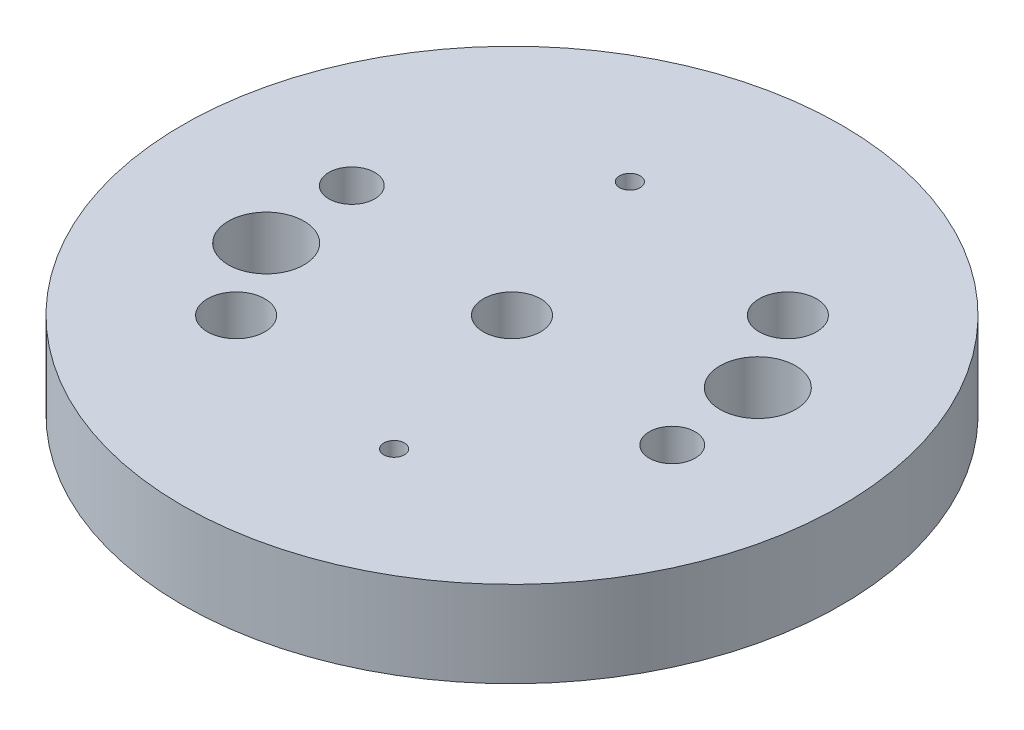
ISO-10303-21;
HEADER;
FILE_DESCRIPTION(('STEP AP214'),'2;1');
FILE_NAME('part.step','',(''),(''),'','','');
FILE_SCHEMA(('AUTOMOTIVE_DESIGN { 1 0 10303 214 1 1 1 1 }'));
ENDSEC;
DATA;
#1=APPLICATION_CONTEXT('core data for automotive mechanical design processes');
#2=APPLICATION_PROTOCOL_DEFINITION('international standard','automotive_design',2000,#1);
#3=PRODUCT_CONTEXT('',#1,'mechanical');
#4=PRODUCT('Part','Part','',(#3));
#5=PRODUCT_RELATED_PRODUCT_CATEGORY('part','',(#4));
#6=PRODUCT_DEFINITION_FORMATION('','',#4);
#7=PRODUCT_DEFINITION_CONTEXT('part definition',#1,'design');
#8=PRODUCT_DEFINITION('design','',#6,#7);
#9=PRODUCT_DEFINITION_SHAPE('','',#8);
#10=(LENGTH_UNIT() NAMED_UNIT(*) SI_UNIT(.MILLI.,.METRE.));
#11=(NAMED_UNIT(*) PLANE_ANGLE_UNIT() SI_UNIT($,.RADIAN.));
#12=(NAMED_UNIT(*) SI_UNIT($,.STERADIAN.) SOLID_ANGLE_UNIT());
#13=UNCERTAINTY_MEASURE_WITH_UNIT(LENGTH_MEASURE(1.E-05),#10,'distance_accuracy_value','');
#14=(GEOMETRIC_REPRESENTATION_CONTEXT(3) GLOBAL_UNCERTAINTY_ASSIGNED_CONTEXT((#13)) GLOBAL_UNIT_ASSIGNED_CONTEXT((#10,
#11,#12)) REPRESENTATION_CONTEXT('',''));
#15=CARTESIAN_POINT('',(0.,0.,0.));
#16=DIRECTION('',(0.,0.,1.));
#17=DIRECTION('',(1.,0.,0.));
#18=AXIS2_PLACEMENT_3D('',#15,#16,#17);
#19=CARTESIAN_POINT('',(0.,-9.525,0.));
#20=DIRECTION('',(0.,1.,0.));
#21=DIRECTION('',(0.,0.,1.));
#22=AXIS2_PLACEMENT_3D('',#19,#20,#21);
#23=CYLINDRICAL_SURFACE('',#22,36.4744);
#24=CARTESIAN_POINT('',(0.,-9.525,0.));
#25=DIRECTION('',(0.,1.,0.));
#26=DIRECTION('',(0.,0.,1.));
#27=AXIS2_PLACEMENT_3D('',#24,#25,#26);
#28=CIRCLE('',#27,36.4744);
#29=CARTESIAN_POINT('',(0.,-9.525,36.4744));
#30=VERTEX_POINT('',#29);
#31=EDGE_CURVE('E41',#30,#30,#28,.T.);
#32=CARTESIAN_POINT('',(0.,0.,0.));
#33=DIRECTION('',(0.,1.,0.));
#34=DIRECTION('',(0.,0.,1.));
#35=AXIS2_PLACEMENT_3D('',#32,#33,#34);
#36=CIRCLE('',#35,36.4744);
#37=CARTESIAN_POINT('',(0.,0.,36.4744));
#38=VERTEX_POINT('',#37);
#39=EDGE_CURVE('E37',#38,#38,#36,.T.);
#40=CARTESIAN_POINT('',(0.,-9.525,36.4744));
#41=CARTESIAN_POINT('',(0.,-9.42578125,36.4744));
#42=CARTESIAN_POINT('',(0.,-9.3265625,36.4744));
#43=CARTESIAN_POINT('',(0.,-9.128125,36.4744));
#44=CARTESIAN_POINT('',(0.,-9.02890625,36.4744));
#45=CARTESIAN_POINT('',(0.,-8.83046875,36.4744));
#46=CARTESIAN_POINT('',(0.,-8.73125,36.4744));
#47=CARTESIAN_POINT('',(0.,-8.5328125,36.4744));
#48=CARTESIAN_POINT('',(0.,-8.43359375,36.4744));
#49=CARTESIAN_POINT('',(0.,-8.23515625,36.4744));
#50=CARTESIAN_POINT('',(0.,-8.1359375,36.4744));
#51=CARTESIAN_POINT('',(0.,-7.9375,36.4744));
#52=CARTESIAN_POINT('',(0.,-7.83828125,36.4744));
#53=CARTESIAN_POINT('',(0.,-7.63984375,36.4744));
#54=CARTESIAN_POINT('',(0.,-7.540625,36.4744));
#55=CARTESIAN_POINT('',(0.,-7.3421875,36.4744));
#56=CARTESIAN_POINT('',(0.,-7.24296875,36.4744));
#57=CARTESIAN_POINT('',(0.,-7.04453125,36.4744));
#58=CARTESIAN_POINT('',(0.,-6.9453125,36.4744));
#59=CARTESIAN_POINT('',(0.,-6.746875,36.4744));
#60=CARTESIAN_POINT('',(0.,-6.64765625,36.4744));
#61=CARTESIAN_POINT('',(0.,-6.44921875,36.4744));
#62=CARTESIAN_POINT('',(0.,-6.35,36.4744));
#63=CARTESIAN_POINT('',(0.,-6.1515625,36.4744));
#64=CARTESIAN_POINT('',(0.,-6.05234375,36.4744));
#65=CARTESIAN_POINT('',(0.,-5.85390625,36.4744));
#66=CARTESIAN_POINT('',(0.,-5.7546875,36.4744));
#67=CARTESIAN_POINT('',(0.,-5.55625,36.4744));
#68=CARTESIAN_POINT('',(0.,-5.45703125,36.4744));
#69=CARTESIAN_POINT('',(0.,-5.25859375,36.4744));
#70=CARTESIAN_POINT('',(0.,-5.159375,36.4744));
#71=CARTESIAN_POINT('',(0.,-4.9609375,36.4744));
#72=CARTESIAN_POINT('',(0.,-4.86171875,36.4744));
#73=CARTESIAN_POINT('',(0.,-4.66328125,36.4744));
#74=CARTESIAN_POINT('',(0.,-4.5640625,36.4744));
#75=CARTESIAN_POINT('',(0.,-4.365625,36.4744));
#76=CARTESIAN_POINT('',(0.,-4.26640625,36.4744));
#77=CARTESIAN_POINT('',(0.,-4.06796875,36.4744));
#78=CARTESIAN_POINT('',(0.,-3.96875,36.4744));
#79=CARTESIAN_POINT('',(0.,-3.7703125,36.4744));
#80=CARTESIAN_POINT('',(0.,-3.67109375,36.4744));
#81=CARTESIAN_POINT('',(0.,-3.47265625,36.4744));
#82=CARTESIAN_POINT('',(0.,-3.3734375,36.4744));
#83=CARTESIAN_POINT('',(0.,-3.175,36.4744));
#84=CARTESIAN_POINT('',(0.,-3.07578125,36.4744));
#85=CARTESIAN_POINT('',(0.,-2.87734375,36.4744));
#86=CARTESIAN_POINT('',(0.,-2.778125,36.4744));
#87=CARTESIAN_POINT('',(0.,-2.5796875,36.4744));
#88=CARTESIAN_POINT('',(0.,-2.48046875,36.4744));
#89=CARTESIAN_POINT('',(0.,-2.28203125,36.4744));
#90=CARTESIAN_POINT('',(0.,-2.1828125,36.4744));
#91=CARTESIAN_POINT('',(0.,-1.984375,36.4744));
#92=CARTESIAN_POINT('',(0.,-1.88515625,36.4744));
#93=CARTESIAN_POINT('',(0.,-1.68671875,36.4744));
#94=CARTESIAN_POINT('',(0.,-1.5875,36.4744));
#95=CARTESIAN_POINT('',(0.,-1.3890625,36.4744));
#96=CARTESIAN_POINT('',(0.,-1.28984375,36.4744));
#97=CARTESIAN_POINT('',(0.,-1.09140625,36.4744));
#98=CARTESIAN_POINT('',(0.,-0.992187500000001,36.4744));
#99=CARTESIAN_POINT('',(0.,-0.793750000000001,36.4744));
#100=CARTESIAN_POINT('',(0.,-0.69453125,36.4744));
#101=CARTESIAN_POINT('',(0.,-0.49609375,36.4744));
#102=CARTESIAN_POINT('',(0.,-0.396875,36.4744));
#103=CARTESIAN_POINT('',(0.,-0.1984375,36.4744));
#104=CARTESIAN_POINT('',(0.,-0.0992187500000001,36.4744));
#105=CARTESIAN_POINT('',(0.,0.,36.4744));
#106=B_SPLINE_CURVE_WITH_KNOTS('',3,(#40,#41,#42,#43,#44,#45,#46,#47,#48,#49,#50,#51,#52,#53,
#54,#55,#56,#57,#58,#59,#60,#61,#62,#63,#64,#65,#66,#67,#68,#69,#70,#71,#72,#73,#74,#75,#76,#77,
#78,#79,#80,#81,#82,#83,#84,#85,#86,#87,#88,#89,#90,#91,#92,#93,#94,#95,#96,#97,#98,#99,#100,
#101,#102,#103,#104,#105),.UNSPECIFIED.,.F.,.F.,(4,2,2,2,2,2,2,2,2,2,2,2,2,2,2,2,2,2,2,2,2,2,2,
2,2,2,2,2,2,2,2,2,4),(0.,0.29765625,0.5953125,0.892968750000001,1.190625,1.48828125,1.7859375,
2.08359375,2.38125,2.67890625,2.9765625,3.27421875,3.571875,3.86953125,4.1671875,4.46484375,
4.7625,5.06015625,5.3578125,5.65546875,5.953125,6.25078125,6.5484375,6.84609375,7.14375,
7.44140625,7.7390625,8.03671875,8.334375,8.63203125,8.9296875,9.22734375,9.525),.UNSPECIFIED.);
#107=EDGE_CURVE('BSEAM34',#30,#38,#106,.T.);
#108=ORIENTED_EDGE('',*,*,#31,.T.);
#109=ORIENTED_EDGE('',*,*,#39,.F.);
#110=ORIENTED_EDGE('',*,*,#107,.T.);
#111=ORIENTED_EDGE('',*,*,#107,.F.);
#112=EDGE_LOOP('',(#108,#110,#109,#111));
#113=FACE_BOUND('',#112,.T.);
#114=ADVANCED_FACE('F34',(#113),#23,.T.);
#115=CARTESIAN_POINT('',(0.,-9.525,0.));
#116=DIRECTION('',(0.,1.,0.));
#117=DIRECTION('',(0.,0.,1.));
#118=AXIS2_PLACEMENT_3D('',#115,#116,#117);
#119=PLANE('',#118);
#120=CARTESIAN_POINT('',(0.,-9.525,0.));
#121=DIRECTION('',(0.,-1.,0.));
#122=DIRECTION('',(0.,0.,-1.));
#123=AXIS2_PLACEMENT_3D('',#120,#121,#122);
#124=CIRCLE('',#123,26.543);
#125=CARTESIAN_POINT('',(0.,-9.525,-26.543));
#126=VERTEX_POINT('',#125);
#127=EDGE_CURVE('E10',#126,#126,#124,.T.);
#128=ORIENTED_EDGE('',*,*,#127,.F.);
#129=EDGE_LOOP('',(#128));
#130=FACE_BOUND('',#129,.T.);
#131=ORIENTED_EDGE('',*,*,#31,.F.);
#132=EDGE_LOOP('',(#131));
#133=FACE_BOUND('',#132,.T.);
#134=ADVANCED_FACE('F120',(#130,#133),#119,.F.);
#135=CARTESIAN_POINT('',(0.,0.,0.));
#136=DIRECTION('',(0.,1.,0.));
#137=DIRECTION('',(0.,0.,1.));
#138=AXIS2_PLACEMENT_3D('',#135,#136,#137);
#139=PLANE('',#138);
#140=CARTESIAN_POINT('',(-6.27922532569888,0.,-19.3254684111175));
#141=DIRECTION('',(0.,1.,0.));
#142=DIRECTION('',(0.,0.,1.));
#143=AXIS2_PLACEMENT_3D('',#140,#141,#142);
#144=CIRCLE('',#143,1.143);
#145=CARTESIAN_POINT('',(-6.27922532569888,0.,-18.1824684111175));
#146=VERTEX_POINT('',#145);
#147=EDGE_CURVE('E76',#146,#146,#144,.T.);
#148=ORIENTED_EDGE('',*,*,#147,.F.);
#149=EDGE_LOOP('',(#148));
#150=FACE_BOUND('',#149,.T.);
#151=CARTESIAN_POINT('',(6.27922532569889,0.,19.3254684111175));
#152=DIRECTION('',(0.,1.,0.));
#153=DIRECTION('',(0.,0.,1.));
#154=AXIS2_PLACEMENT_3D('',#151,#152,#153);
#155=CIRCLE('',#154,1.143);
#156=CARTESIAN_POINT('',(6.27922532569889,0.,20.4684684111175));
#157=VERTEX_POINT('',#156);
#158=EDGE_CURVE('E70',#157,#157,#155,.T.);
#159=ORIENTED_EDGE('',*,*,#158,.F.);
#160=EDGE_LOOP('',(#159));
#161=FACE_BOUND('',#160,.T.);
#162=CARTESIAN_POINT('',(-20.5333101868124,0.,6.67167690855514));
#163=DIRECTION('',(0.,1.,0.));
#164=DIRECTION('',(0.,0.,1.));
#165=AXIS2_PLACEMENT_3D('',#162,#163,#164);
#166=CIRCLE('',#165,4.191);
#167=CARTESIAN_POINT('',(-20.5333101868124,0.,10.8626769085551));
#168=VERTEX_POINT('',#167);
#169=EDGE_CURVE('E64',#168,#168,#166,.T.);
#170=ORIENTED_EDGE('',*,*,#169,.F.);
#171=EDGE_LOOP('',(#170));
#172=FACE_BOUND('',#171,.T.);
#173=CARTESIAN_POINT('',(-21.2939061371888,0.,-3.56337781053203));
#174=DIRECTION('',(0.,1.,0.));
#175=DIRECTION('',(0.,0.,1.));
#176=AXIS2_PLACEMENT_3D('',#173,#174,#175);
#177=CIRCLE('',#176,2.54);
#178=CARTESIAN_POINT('',(-21.2939061371888,0.,-1.02337781053203));
#179=VERTEX_POINT('',#178);
#180=EDGE_CURVE('E57',#179,#179,#177,.T.);
#181=ORIENTED_EDGE('',*,*,#180,.F.);
#182=EDGE_LOOP('',(#181));
#183=FACE_BOUND('',#182,.T.);
#184=CARTESIAN_POINT('',(21.2939061371888,0.,3.56337781053203));
#185=DIRECTION('',(0.,1.,0.));
#186=DIRECTION('',(0.,0.,1.));
#187=AXIS2_PLACEMENT_3D('',#184,#185,#186);
#188=CIRCLE('',#187,2.54);
#189=CARTESIAN_POINT('',(21.2939061371888,0.,6.10337781053203));
#190=VERTEX_POINT('',#189);
#191=EDGE_CURVE('E93',#190,#190,#188,.T.);
#192=ORIENTED_EDGE('',*,*,#191,.F.);
#193=EDGE_LOOP('',(#192));
#194=FACE_BOUND('',#193,.T.);
#195=CARTESIAN_POINT('',(15.2664354058176,0.,-15.2664354058175));
#196=DIRECTION('',(0.,1.,0.));
#197=DIRECTION('',(0.,0.,1.));
#198=AXIS2_PLACEMENT_3D('',#195,#196,#197);
#199=CIRCLE('',#198,3.175);
#200=CARTESIAN_POINT('',(15.2664354058176,0.,-12.0914354058175));
#201=VERTEX_POINT('',#200);
#202=EDGE_CURVE('E99',#201,#201,#199,.T.);
#203=ORIENTED_EDGE('',*,*,#202,.F.);
#204=EDGE_LOOP('',(#203));
#205=FACE_BOUND('',#204,.T.);
#206=CARTESIAN_POINT('',(20.5333101868124,0.,-6.67167690855514));
#207=DIRECTION('',(0.,1.,0.));
#208=DIRECTION('',(0.,0.,1.));
#209=AXIS2_PLACEMENT_3D('',#206,#207,#208);
#210=CIRCLE('',#209,4.191);
#211=CARTESIAN_POINT('',(20.5333101868124,0.,-2.48067690855514));
#212=VERTEX_POINT('',#211);
#213=EDGE_CURVE('E81',#212,#212,#210,.T.);
#214=ORIENTED_EDGE('',*,*,#213,.F.);
#215=EDGE_LOOP('',(#214));
#216=FACE_BOUND('',#215,.T.);
#217=CARTESIAN_POINT('',(-15.2664354058176,0.,15.2664354058175));
#218=DIRECTION('',(0.,1.,0.));
#219=DIRECTION('',(0.,0.,1.));
#220=AXIS2_PLACEMENT_3D('',#217,#218,#219);
#221=CIRCLE('',#220,3.175);
#222=CARTESIAN_POINT('',(-15.2664354058176,0.,18.4414354058175));
#223=VERTEX_POINT('',#222);
#224=EDGE_CURVE('E88',#223,#223,#221,.T.);
#225=ORIENTED_EDGE('',*,*,#224,.F.);
#226=EDGE_LOOP('',(#225));
#227=FACE_BOUND('',#226,.T.);
#228=CARTESIAN_POINT('',(0.,0.,0.));
#229=DIRECTION('',(0.,1.,0.));
#230=DIRECTION('',(0.,0.,1.));
#231=AXIS2_PLACEMENT_3D('',#228,#229,#230);
#232=CIRCLE('',#231,3.175);
#233=CARTESIAN_POINT('',(0.,0.,3.175));
#234=VERTEX_POINT('',#233);
#235=EDGE_CURVE('E51',#234,#234,#232,.T.);
#236=ORIENTED_EDGE('',*,*,#235,.F.);
#237=EDGE_LOOP('',(#236));
#238=FACE_BOUND('',#237,.T.);
#239=ORIENTED_EDGE('',*,*,#39,.T.);
#240=EDGE_LOOP('',(#239));
#241=FACE_BOUND('',#240,.T.);
#242=ADVANCED_FACE('F116',(#150,#161,#172,#183,#194,#205,#216,#227,#238,#241),#139,.T.);
#243=CARTESIAN_POINT('',(0.,-12.7,0.));
#244=DIRECTION('',(0.,1.,0.));
#245=DIRECTION('',(0.,0.,1.));
#246=AXIS2_PLACEMENT_3D('',#243,#244,#245);
#247=CYLINDRICAL_SURFACE('',#246,26.543);
#248=CARTESIAN_POINT('',(0.,-12.7,0.));
#249=DIRECTION('',(0.,-1.,0.));
#250=DIRECTION('',(0.,0.,-1.));
#251=AXIS2_PLACEMENT_3D('',#248,#249,#250);
#252=CIRCLE('',#251,26.543);
#253=CARTESIAN_POINT('',(0.,-12.7,-26.543));
#254=VERTEX_POINT('',#253);
#255=EDGE_CURVE('E47',#254,#254,#252,.T.);
#256=ORIENTED_EDGE('',*,*,#255,.F.);
#257=EDGE_LOOP('',(#256));
#258=FACE_BOUND('',#257,.T.);
#259=ORIENTED_EDGE('',*,*,#127,.T.);
#260=EDGE_LOOP('',(#259));
#261=FACE_BOUND('',#260,.T.);
#262=ADVANCED_FACE('F119',(#258,#261),#247,.T.);
#263=CARTESIAN_POINT('',(0.,-12.7,0.));
#264=DIRECTION('',(0.,-1.,0.));
#265=DIRECTION('',(0.,0.,-1.));
#266=AXIS2_PLACEMENT_3D('',#263,#264,#265);
#267=PLANE('',#266);
#268=CARTESIAN_POINT('',(-6.27922532569888,-12.7,-19.3254684111175));
#269=DIRECTION('',(0.,1.,0.));
#270=DIRECTION('',(0.,0.,1.));
#271=AXIS2_PLACEMENT_3D('',#268,#269,#270);
#272=CIRCLE('',#271,1.143);
#273=CARTESIAN_POINT('',(-6.27922532569888,-12.7,-18.1824684111175));
#274=VERTEX_POINT('',#273);
#275=EDGE_CURVE('E54',#274,#274,#272,.T.);
#276=ORIENTED_EDGE('',*,*,#275,.T.);
#277=EDGE_LOOP('',(#276));
#278=FACE_BOUND('',#277,.T.);
#279=CARTESIAN_POINT('',(6.27922532569889,-12.7,19.3254684111175));
#280=DIRECTION('',(0.,1.,0.));
#281=DIRECTION('',(0.,0.,1.));
#282=AXIS2_PLACEMENT_3D('',#279,#280,#281);
#283=CIRCLE('',#282,1.143);
#284=CARTESIAN_POINT('',(6.27922532569889,-12.7,20.4684684111175));
#285=VERTEX_POINT('',#284);
#286=EDGE_CURVE('E73',#285,#285,#283,.T.);
#287=ORIENTED_EDGE('',*,*,#286,.T.);
#288=EDGE_LOOP('',(#287));
#289=FACE_BOUND('',#288,.T.);
#290=CARTESIAN_POINT('',(-20.5333101868124,-12.7,6.67167690855514));
#291=DIRECTION('',(0.,1.,0.));
#292=DIRECTION('',(0.,0.,1.));
#293=AXIS2_PLACEMENT_3D('',#290,#291,#292);
#294=CIRCLE('',#293,4.191);
#295=CARTESIAN_POINT('',(-20.5333101868124,-12.7,10.8626769085551));
#296=VERTEX_POINT('',#295);
#297=EDGE_CURVE('E67',#296,#296,#294,.T.);
#298=ORIENTED_EDGE('',*,*,#297,.T.);
#299=EDGE_LOOP('',(#298));
#300=FACE_BOUND('',#299,.T.);
#301=CARTESIAN_POINT('',(-21.2939061371888,-12.7,-3.56337781053203));
#302=DIRECTION('',(0.,1.,0.));
#303=DIRECTION('',(0.,0.,1.));
#304=AXIS2_PLACEMENT_3D('',#301,#302,#303);
#305=CIRCLE('',#304,2.54);
#306=CARTESIAN_POINT('',(-21.2939061371888,-12.7,-1.02337781053203));
#307=VERTEX_POINT('',#306);
#308=EDGE_CURVE('E60',#307,#307,#305,.T.);
#309=ORIENTED_EDGE('',*,*,#308,.T.);
#310=EDGE_LOOP('',(#309));
#311=FACE_BOUND('',#310,.T.);
#312=CARTESIAN_POINT('',(21.2939061371888,-12.7,3.56337781053203));
#313=DIRECTION('',(0.,1.,0.));
#314=DIRECTION('',(0.,0.,1.));
#315=AXIS2_PLACEMENT_3D('',#312,#313,#314);
#316=CIRCLE('',#315,2.54);
#317=CARTESIAN_POINT('',(21.2939061371888,-12.7,6.10337781053203));
#318=VERTEX_POINT('',#317);
#319=EDGE_CURVE('E96',#318,#318,#316,.T.);
#320=ORIENTED_EDGE('',*,*,#319,.T.);
#321=EDGE_LOOP('',(#320));
#322=FACE_BOUND('',#321,.T.);
#323=CARTESIAN_POINT('',(15.2664354058176,-12.7,-15.2664354058175));
#324=DIRECTION('',(0.,1.,0.));
#325=DIRECTION('',(0.,0.,1.));
#326=AXIS2_PLACEMENT_3D('',#323,#324,#325);
#327=CIRCLE('',#326,3.175);
#328=CARTESIAN_POINT('',(15.2664354058176,-12.7,-12.0914354058175));
#329=VERTEX_POINT('',#328);
#330=EDGE_CURVE('E85',#329,#329,#327,.T.);
#331=ORIENTED_EDGE('',*,*,#330,.T.);
#332=EDGE_LOOP('',(#331));
#333=FACE_BOUND('',#332,.T.);
#334=CARTESIAN_POINT('',(20.5333101868124,-12.7,-6.67167690855514));
#335=DIRECTION('',(0.,1.,0.));
#336=DIRECTION('',(0.,0.,1.));
#337=AXIS2_PLACEMENT_3D('',#334,#335,#336);
#338=CIRCLE('',#337,4.191);
#339=CARTESIAN_POINT('',(20.5333101868124,-12.7,-2.48067690855514));
#340=VERTEX_POINT('',#339);
#341=EDGE_CURVE('E84',#340,#340,#338,.T.);
#342=ORIENTED_EDGE('',*,*,#341,.T.);
#343=EDGE_LOOP('',(#342));
#344=FACE_BOUND('',#343,.T.);
#345=CARTESIAN_POINT('',(-15.2664354058176,-12.7,15.2664354058175));
#346=DIRECTION('',(0.,1.,0.));
#347=DIRECTION('',(0.,0.,1.));
#348=AXIS2_PLACEMENT_3D('',#345,#346,#347);
#349=CIRCLE('',#348,3.175);
#350=CARTESIAN_POINT('',(-15.2664354058176,-12.7,18.4414354058175));
#351=VERTEX_POINT('',#350);
#352=EDGE_CURVE('E61',#351,#351,#349,.T.);
#353=ORIENTED_EDGE('',*,*,#352,.T.);
#354=EDGE_LOOP('',(#353));
#355=FACE_BOUND('',#354,.T.);
#356=CARTESIAN_POINT('',(0.,-12.7,0.));
#357=DIRECTION('',(0.,1.,0.));
#358=DIRECTION('',(0.,0.,1.));
#359=AXIS2_PLACEMENT_3D('',#356,#357,#358);
#360=CIRCLE('',#359,3.175);
#361=CARTESIAN_POINT('',(0.,-12.7,3.175));
#362=VERTEX_POINT('',#361);
#363=EDGE_CURVE('E50',#362,#362,#360,.T.);
#364=ORIENTED_EDGE('',*,*,#363,.T.);
#365=EDGE_LOOP('',(#364));
#366=FACE_BOUND('',#365,.T.);
#367=ORIENTED_EDGE('',*,*,#255,.T.);
#368=EDGE_LOOP('',(#367));
#369=FACE_BOUND('',#368,.T.);
#370=ADVANCED_FACE('F105',(#278,#289,#300,#311,#322,#333,#344,#355,#366,#369),#267,.T.);
#371=CARTESIAN_POINT('',(0.,-12.7,0.));
#372=DIRECTION('',(0.,1.,0.));
#373=DIRECTION('',(0.,0.,1.));
#374=AXIS2_PLACEMENT_3D('',#371,#372,#373);
#375=CYLINDRICAL_SURFACE('',#374,3.175);
#376=ORIENTED_EDGE('',*,*,#363,.F.);
#377=EDGE_LOOP('',(#376));
#378=FACE_BOUND('',#377,.T.);
#379=ORIENTED_EDGE('',*,*,#235,.T.);
#380=EDGE_LOOP('',(#379));
#381=FACE_BOUND('',#380,.T.);
#382=ADVANCED_FACE('F149',(#378,#381),#375,.F.);
#383=CARTESIAN_POINT('',(-15.2664354058176,-12.7,15.2664354058175));
#384=DIRECTION('',(0.,1.,0.));
#385=DIRECTION('',(0.,0.,1.));
#386=AXIS2_PLACEMENT_3D('',#383,#384,#385);
#387=CYLINDRICAL_SURFACE('',#386,3.175);
#388=ORIENTED_EDGE('',*,*,#352,.F.);
#389=EDGE_LOOP('',(#388));
#390=FACE_BOUND('',#389,.T.);
#391=ORIENTED_EDGE('',*,*,#224,.T.);
#392=EDGE_LOOP('',(#391));
#393=FACE_BOUND('',#392,.T.);
#394=ADVANCED_FACE('F153',(#390,#393),#387,.F.);
#395=CARTESIAN_POINT('',(20.5333101868124,-12.7,-6.67167690855514));
#396=DIRECTION('',(0.,1.,0.));
#397=DIRECTION('',(0.,0.,1.));
#398=AXIS2_PLACEMENT_3D('',#395,#396,#397);
#399=CYLINDRICAL_SURFACE('',#398,4.191);
#400=ORIENTED_EDGE('',*,*,#341,.F.);
#401=EDGE_LOOP('',(#400));
#402=FACE_BOUND('',#401,.T.);
#403=ORIENTED_EDGE('',*,*,#213,.T.);
#404=EDGE_LOOP('',(#403));
#405=FACE_BOUND('',#404,.T.);
#406=ADVANCED_FACE('F112',(#402,#405),#399,.F.);
#407=CARTESIAN_POINT('',(15.2664354058176,-12.7,-15.2664354058175));
#408=DIRECTION('',(0.,1.,0.));
#409=DIRECTION('',(0.,0.,1.));
#410=AXIS2_PLACEMENT_3D('',#407,#408,#409);
#411=CYLINDRICAL_SURFACE('',#410,3.175);
#412=ORIENTED_EDGE('',*,*,#330,.F.);
#413=EDGE_LOOP('',(#412));
#414=FACE_BOUND('',#413,.T.);
#415=ORIENTED_EDGE('',*,*,#202,.T.);
#416=EDGE_LOOP('',(#415));
#417=FACE_BOUND('',#416,.T.);
#418=ADVANCED_FACE('F108',(#414,#417),#411,.F.);
#419=CARTESIAN_POINT('',(21.2939061371888,-12.7,3.56337781053203));
#420=DIRECTION('',(0.,1.,0.));
#421=DIRECTION('',(0.,0.,1.));
#422=AXIS2_PLACEMENT_3D('',#419,#420,#421);
#423=CYLINDRICAL_SURFACE('',#422,2.54);
#424=ORIENTED_EDGE('',*,*,#319,.F.);
#425=EDGE_LOOP('',(#424));
#426=FACE_BOUND('',#425,.T.);
#427=ORIENTED_EDGE('',*,*,#191,.T.);
#428=EDGE_LOOP('',(#427));
#429=FACE_BOUND('',#428,.T.);
#430=ADVANCED_FACE('F111',(#426,#429),#423,.F.);
#431=CARTESIAN_POINT('',(-21.2939061371888,-12.7,-3.56337781053203));
#432=DIRECTION('',(0.,1.,0.));
#433=DIRECTION('',(0.,0.,1.));
#434=AXIS2_PLACEMENT_3D('',#431,#432,#433);
#435=CYLINDRICAL_SURFACE('',#434,2.54);
#436=ORIENTED_EDGE('',*,*,#308,.F.);
#437=EDGE_LOOP('',(#436));
#438=FACE_BOUND('',#437,.T.);
#439=ORIENTED_EDGE('',*,*,#180,.T.);
#440=EDGE_LOOP('',(#439));
#441=FACE_BOUND('',#440,.T.);
#442=ADVANCED_FACE('F155',(#438,#441),#435,.F.);
#443=CARTESIAN_POINT('',(-20.5333101868124,-12.7,6.67167690855514));
#444=DIRECTION('',(0.,1.,0.));
#445=DIRECTION('',(0.,0.,1.));
#446=AXIS2_PLACEMENT_3D('',#443,#444,#445);
#447=CYLINDRICAL_SURFACE('',#446,4.191);
#448=ORIENTED_EDGE('',*,*,#297,.F.);
#449=EDGE_LOOP('',(#448));
#450=FACE_BOUND('',#449,.T.);
#451=ORIENTED_EDGE('',*,*,#169,.T.);
#452=EDGE_LOOP('',(#451));
#453=FACE_BOUND('',#452,.T.);
#454=ADVANCED_FACE('F158',(#450,#453),#447,.F.);
#455=CARTESIAN_POINT('',(6.27922532569889,-12.7,19.3254684111175));
#456=DIRECTION('',(0.,1.,0.));
#457=DIRECTION('',(0.,0.,1.));
#458=AXIS2_PLACEMENT_3D('',#455,#456,#457);
#459=CYLINDRICAL_SURFACE('',#458,1.143);
#460=ORIENTED_EDGE('',*,*,#286,.F.);
#461=EDGE_LOOP('',(#460));
#462=FACE_BOUND('',#461,.T.);
#463=ORIENTED_EDGE('',*,*,#158,.T.);
#464=EDGE_LOOP('',(#463));
#465=FACE_BOUND('',#464,.T.);
#466=ADVANCED_FACE('F162',(#462,#465),#459,.F.);
#467=CARTESIAN_POINT('',(-6.27922532569888,-12.7,-19.3254684111175));
#468=DIRECTION('',(0.,1.,0.));
#469=DIRECTION('',(0.,0.,1.));
#470=AXIS2_PLACEMENT_3D('',#467,#468,#469);
#471=CYLINDRICAL_SURFACE('',#470,1.143);
#472=ORIENTED_EDGE('',*,*,#275,.F.);
#473=EDGE_LOOP('',(#472));
#474=FACE_BOUND('',#473,.T.);
#475=ORIENTED_EDGE('',*,*,#147,.T.);
#476=EDGE_LOOP('',(#475));
#477=FACE_BOUND('',#476,.T.);
#478=ADVANCED_FACE('F166',(#474,#477),#471,.F.);
#479=CLOSED_SHELL('',(#114,#134,#242,#262,#370,#382,#394,#406,#418,#430,#442,#454,#466,#478));
#480=MANIFOLD_SOLID_BREP('B2',#479);
#481=ADVANCED_BREP_SHAPE_REPRESENTATION('',(#18,#480),#14);
#482=SHAPE_DEFINITION_REPRESENTATION(#9,#481);
ENDSEC;
END-ISO-10303-21;
